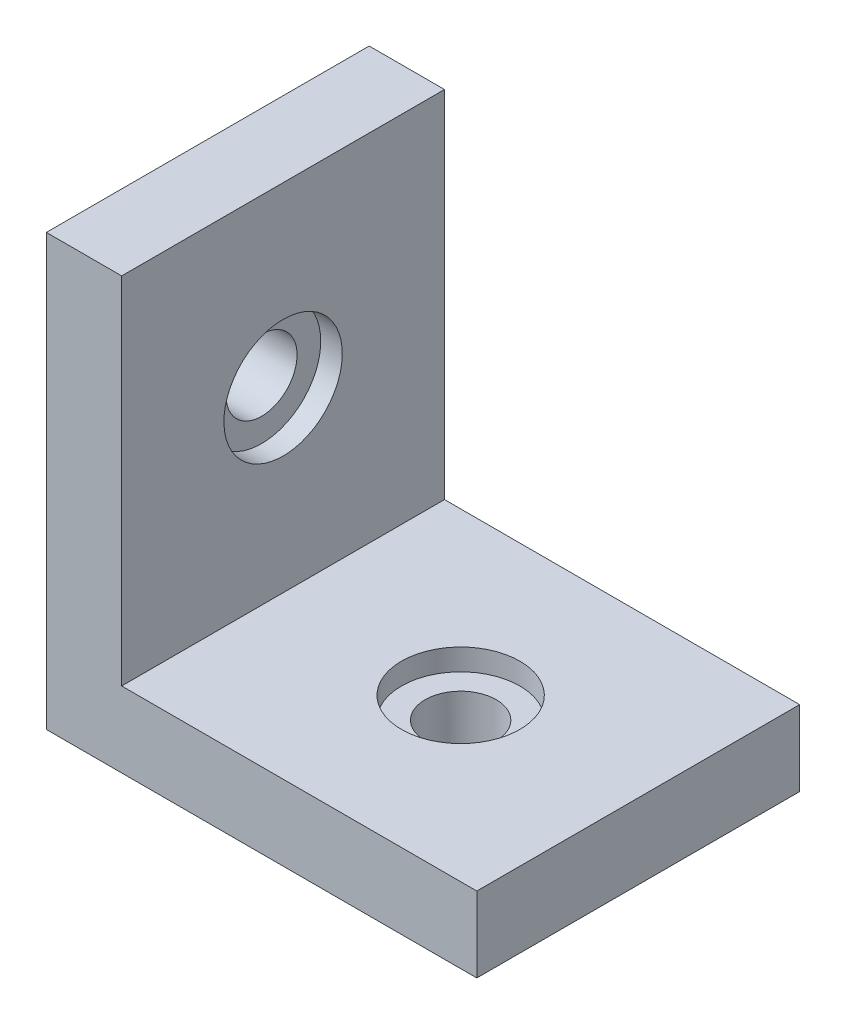
ISO-10303-21;
HEADER;
FILE_DESCRIPTION(('STEP AP214'),'2;1');
FILE_NAME('part.step','',(''),(''),'','','');
FILE_SCHEMA(('AUTOMOTIVE_DESIGN { 1 0 10303 214 1 1 1 1 }'));
ENDSEC;
DATA;
#1=APPLICATION_CONTEXT('core data for automotive mechanical design processes');
#2=APPLICATION_PROTOCOL_DEFINITION('international standard','automotive_design',2000,#1);
#3=PRODUCT_CONTEXT('',#1,'mechanical');
#4=PRODUCT('Part','Part','',(#3));
#5=PRODUCT_RELATED_PRODUCT_CATEGORY('part','',(#4));
#6=PRODUCT_DEFINITION_FORMATION('','',#4);
#7=PRODUCT_DEFINITION_CONTEXT('part definition',#1,'design');
#8=PRODUCT_DEFINITION('design','',#6,#7);
#9=PRODUCT_DEFINITION_SHAPE('','',#8);
#10=(LENGTH_UNIT() NAMED_UNIT(*) SI_UNIT(.MILLI.,.METRE.));
#11=(NAMED_UNIT(*) PLANE_ANGLE_UNIT() SI_UNIT($,.RADIAN.));
#12=(NAMED_UNIT(*) SI_UNIT($,.STERADIAN.) SOLID_ANGLE_UNIT());
#13=UNCERTAINTY_MEASURE_WITH_UNIT(LENGTH_MEASURE(1.E-05),#10,'distance_accuracy_value','');
#14=(GEOMETRIC_REPRESENTATION_CONTEXT(3) GLOBAL_UNCERTAINTY_ASSIGNED_CONTEXT((#13)) GLOBAL_UNIT_ASSIGNED_CONTEXT((#10,
#11,#12)) REPRESENTATION_CONTEXT('',''));
#15=CARTESIAN_POINT('',(0.,0.,0.));
#16=DIRECTION('',(0.,0.,1.));
#17=DIRECTION('',(1.,0.,0.));
#18=AXIS2_PLACEMENT_3D('',#15,#16,#17);
#19=CARTESIAN_POINT('',(-10.5320903285774,11.2977885735323,15.));
#20=DIRECTION('',(0.,1.,0.));
#21=DIRECTION('',(0.,0.,1.));
#22=AXIS2_PLACEMENT_3D('',#19,#20,#21);
#23=PLANE('',#22);
#24=DIRECTION('',(1.,0.,0.));
#25=VECTOR('',#24,1.);
#26=CARTESIAN_POINT('',(-10.5320903285774,11.2977885735323,0.));
#27=LINE('',#26,#25);
#28=CARTESIAN_POINT('',(-12.1110377274454,11.2977885735323,0.));
#29=VERTEX_POINT('',#28);
#30=CARTESIAN_POINT('',(-8.61103772744536,11.2977885735323,0.));
#31=VERTEX_POINT('',#30);
#32=EDGE_CURVE('E129',#29,#31,#27,.T.);
#33=ORIENTED_EDGE('',*,*,#32,.F.);
#34=DIRECTION('',(0.,0.,-1.));
#35=VECTOR('',#34,1.);
#36=CARTESIAN_POINT('',(-12.1110377274454,11.2977885735323,15.));
#37=LINE('',#36,#35);
#38=CARTESIAN_POINT('',(-12.1110377274454,11.2977885735323,15.));
#39=VERTEX_POINT('',#38);
#40=EDGE_CURVE('E10',#39,#29,#37,.T.);
#41=ORIENTED_EDGE('',*,*,#40,.F.);
#42=DIRECTION('',(1.,0.,0.));
#43=VECTOR('',#42,1.);
#44=CARTESIAN_POINT('',(-10.5320903285774,11.2977885735323,15.));
#45=LINE('',#44,#43);
#46=CARTESIAN_POINT('',(-8.61103772744536,11.2977885735323,15.));
#47=VERTEX_POINT('',#46);
#48=EDGE_CURVE('E102',#39,#47,#45,.T.);
#49=ORIENTED_EDGE('',*,*,#48,.T.);
#50=DIRECTION('',(0.,0.,-1.));
#51=VECTOR('',#50,1.);
#52=CARTESIAN_POINT('',(-8.61103772744536,11.2977885735323,15.));
#53=LINE('',#52,#51);
#54=EDGE_CURVE('E128',#47,#31,#53,.T.);
#55=ORIENTED_EDGE('',*,*,#54,.T.);
#56=EDGE_LOOP('',(#33,#41,#49,#55));
#57=FACE_BOUND('',#56,.T.);
#58=ADVANCED_FACE('F16',(#57),#23,.T.);
#59=CARTESIAN_POINT('',(-12.1110377274454,0.0697183422744274,15.));
#60=DIRECTION('',(1.,0.,0.));
#61=DIRECTION('',(0.,0.,-1.));
#62=AXIS2_PLACEMENT_3D('',#59,#60,#61);
#63=PLANE('',#62);
#64=CARTESIAN_POINT('',(-12.1110377274363,3.04778857353234,7.5));
#65=DIRECTION('',(1.,0.,0.));
#66=DIRECTION('',(0.,0.,-1.));
#67=AXIS2_PLACEMENT_3D('',#64,#65,#66);
#68=CIRCLE('',#67,1.65);
#69=CARTESIAN_POINT('',(-12.1110377274363,3.04778857353234,5.85));
#70=VERTEX_POINT('',#69);
#71=EDGE_CURVE('E133',#70,#70,#68,.F.);
#72=ORIENTED_EDGE('',*,*,#71,.F.);
#73=EDGE_LOOP('',(#72));
#74=FACE_BOUND('',#73,.T.);
#75=DIRECTION('',(0.,-1.,0.));
#76=VECTOR('',#75,1.);
#77=CARTESIAN_POINT('',(-12.1110377274454,0.0697183422744274,0.));
#78=LINE('',#77,#76);
#79=CARTESIAN_POINT('',(-12.1110377274454,-8.70221142646765,0.));
#80=VERTEX_POINT('',#79);
#81=EDGE_CURVE('E109',#29,#80,#78,.T.);
#82=ORIENTED_EDGE('',*,*,#81,.T.);
#83=DIRECTION('',(0.,0.,-1.));
#84=VECTOR('',#83,1.);
#85=CARTESIAN_POINT('',(-12.1110377274454,-8.70221142646765,15.));
#86=LINE('',#85,#84);
#87=CARTESIAN_POINT('',(-12.1110377274454,-8.70221142646765,15.));
#88=VERTEX_POINT('',#87);
#89=EDGE_CURVE('E25',#88,#80,#86,.T.);
#90=ORIENTED_EDGE('',*,*,#89,.F.);
#91=DIRECTION('',(0.,-1.,0.));
#92=VECTOR('',#91,1.);
#93=CARTESIAN_POINT('',(-12.1110377274454,0.0697183422744274,15.));
#94=LINE('',#93,#92);
#95=EDGE_CURVE('E96',#39,#88,#94,.T.);
#96=ORIENTED_EDGE('',*,*,#95,.F.);
#97=ORIENTED_EDGE('',*,*,#40,.T.);
#98=EDGE_LOOP('',(#82,#90,#96,#97));
#99=FACE_BOUND('',#98,.T.);
#100=ADVANCED_FACE('F107',(#74,#99),#63,.F.);
#101=CARTESIAN_POINT('',(-2.11103772744537,-8.70221142646765,15.));
#102=DIRECTION('',(0.,1.,0.));
#103=DIRECTION('',(0.,0.,1.));
#104=AXIS2_PLACEMENT_3D('',#101,#102,#103);
#105=PLANE('',#104);
#106=CARTESIAN_POINT('',(-0.361037727445362,-8.70221142645278,7.5));
#107=DIRECTION('',(0.,1.,0.));
#108=DIRECTION('',(0.,0.,1.));
#109=AXIS2_PLACEMENT_3D('',#106,#107,#108);
#110=CIRCLE('',#109,1.65);
#111=CARTESIAN_POINT('',(-0.361037727445362,-8.70221142645278,9.15));
#112=VERTEX_POINT('',#111);
#113=EDGE_CURVE('E175',#112,#112,#110,.F.);
#114=ORIENTED_EDGE('',*,*,#113,.F.);
#115=EDGE_LOOP('',(#114));
#116=FACE_BOUND('',#115,.T.);
#117=DIRECTION('',(1.,0.,0.));
#118=VECTOR('',#117,1.);
#119=CARTESIAN_POINT('',(-2.11103772744537,-8.70221142646765,0.));
#120=LINE('',#119,#118);
#121=CARTESIAN_POINT('',(7.88896227255464,-8.70221142646765,0.));
#122=VERTEX_POINT('',#121);
#123=EDGE_CURVE('E67',#80,#122,#120,.T.);
#124=ORIENTED_EDGE('',*,*,#123,.T.);
#125=DIRECTION('',(0.,0.,-1.));
#126=VECTOR('',#125,1.);
#127=CARTESIAN_POINT('',(7.88896227255464,-8.70221142646765,15.));
#128=LINE('',#127,#126);
#129=CARTESIAN_POINT('',(7.88896227255464,-8.70221142646765,15.));
#130=VERTEX_POINT('',#129);
#131=EDGE_CURVE('E111',#130,#122,#128,.T.);
#132=ORIENTED_EDGE('',*,*,#131,.F.);
#133=DIRECTION('',(1.,0.,0.));
#134=VECTOR('',#133,1.);
#135=CARTESIAN_POINT('',(-2.11103772744537,-8.70221142646765,15.));
#136=LINE('',#135,#134);
#137=EDGE_CURVE('E100',#88,#130,#136,.T.);
#138=ORIENTED_EDGE('',*,*,#137,.F.);
#139=ORIENTED_EDGE('',*,*,#89,.T.);
#140=EDGE_LOOP('',(#124,#132,#138,#139));
#141=FACE_BOUND('',#140,.T.);
#142=ADVANCED_FACE('F113',(#116,#141),#105,.F.);
#143=CARTESIAN_POINT('',(7.88896227255464,-7.47414119520973,15.));
#144=DIRECTION('',(-1.,0.,0.));
#145=DIRECTION('',(0.,0.,1.));
#146=AXIS2_PLACEMENT_3D('',#143,#144,#145);
#147=PLANE('',#146);
#148=DIRECTION('',(0.,1.,0.));
#149=VECTOR('',#148,1.);
#150=CARTESIAN_POINT('',(7.88896227255464,-7.47414119520973,0.));
#151=LINE('',#150,#149);
#152=CARTESIAN_POINT('',(7.88896227255464,-5.20221142646766,0.));
#153=VERTEX_POINT('',#152);
#154=EDGE_CURVE('E140',#122,#153,#151,.T.);
#155=ORIENTED_EDGE('',*,*,#154,.T.);
#156=DIRECTION('',(0.,0.,-1.));
#157=VECTOR('',#156,1.);
#158=CARTESIAN_POINT('',(7.88896227255464,-5.20221142646766,15.));
#159=LINE('',#158,#157);
#160=CARTESIAN_POINT('',(7.88896227255464,-5.20221142646766,15.));
#161=VERTEX_POINT('',#160);
#162=EDGE_CURVE('E75',#161,#153,#159,.T.);
#163=ORIENTED_EDGE('',*,*,#162,.F.);
#164=DIRECTION('',(0.,1.,0.));
#165=VECTOR('',#164,1.);
#166=CARTESIAN_POINT('',(7.88896227255464,-7.47414119520973,15.));
#167=LINE('',#166,#165);
#168=EDGE_CURVE('E38',#130,#161,#167,.T.);
#169=ORIENTED_EDGE('',*,*,#168,.F.);
#170=ORIENTED_EDGE('',*,*,#131,.T.);
#171=EDGE_LOOP('',(#155,#163,#169,#170));
#172=FACE_BOUND('',#171,.T.);
#173=ADVANCED_FACE('F216',(#172),#147,.F.);
#174=CARTESIAN_POINT('',(-2.11103772744537,-5.20221142646766,15.));
#175=DIRECTION('',(0.,1.,0.));
#176=DIRECTION('',(0.,0.,1.));
#177=AXIS2_PLACEMENT_3D('',#174,#175,#176);
#178=PLANE('',#177);
#179=CARTESIAN_POINT('',(-0.361037727445362,-5.20221142646766,7.5));
#180=DIRECTION('',(0.,1.,0.));
#181=DIRECTION('',(-1.,0.,0.));
#182=AXIS2_PLACEMENT_3D('',#179,#180,#181);
#183=CIRCLE('',#182,2.75);
#184=CARTESIAN_POINT('',(-3.11103772744536,-5.20221142646766,7.5));
#185=VERTEX_POINT('',#184);
#186=EDGE_CURVE('E186',#185,#185,#183,.T.);
#187=ORIENTED_EDGE('',*,*,#186,.F.);
#188=EDGE_LOOP('',(#187));
#189=FACE_BOUND('',#188,.T.);
#190=DIRECTION('',(1.,0.,0.));
#191=VECTOR('',#190,1.);
#192=CARTESIAN_POINT('',(-2.11103772744537,-5.20221142646766,0.));
#193=LINE('',#192,#191);
#194=CARTESIAN_POINT('',(-8.61103772744536,-5.20221142646766,0.));
#195=VERTEX_POINT('',#194);
#196=EDGE_CURVE('E137',#195,#153,#193,.T.);
#197=ORIENTED_EDGE('',*,*,#196,.F.);
#198=DIRECTION('',(0.,0.,-1.));
#199=VECTOR('',#198,1.);
#200=CARTESIAN_POINT('',(-8.61103772744536,-5.20221142646766,15.));
#201=LINE('',#200,#199);
#202=CARTESIAN_POINT('',(-8.61103772744536,-5.20221142646766,15.));
#203=VERTEX_POINT('',#202);
#204=EDGE_CURVE('E149',#203,#195,#201,.T.);
#205=ORIENTED_EDGE('',*,*,#204,.F.);
#206=DIRECTION('',(1.,0.,0.));
#207=VECTOR('',#206,1.);
#208=CARTESIAN_POINT('',(-2.11103772744537,-5.20221142646766,15.));
#209=LINE('',#208,#207);
#210=EDGE_CURVE('E115',#203,#161,#209,.T.);
#211=ORIENTED_EDGE('',*,*,#210,.T.);
#212=ORIENTED_EDGE('',*,*,#162,.T.);
#213=EDGE_LOOP('',(#197,#205,#211,#212));
#214=FACE_BOUND('',#213,.T.);
#215=ADVANCED_FACE('F158',(#189,#214),#178,.T.);
#216=CARTESIAN_POINT('',(-8.61103772744536,0.0697183422744274,15.));
#217=DIRECTION('',(1.,0.,0.));
#218=DIRECTION('',(0.,1.,0.));
#219=AXIS2_PLACEMENT_3D('',#216,#217,#218);
#220=PLANE('',#219);
#221=CARTESIAN_POINT('',(-8.61103772744536,3.04778857353234,7.5));
#222=DIRECTION('',(1.,0.,0.));
#223=DIRECTION('',(0.,1.,0.));
#224=AXIS2_PLACEMENT_3D('',#221,#222,#223);
#225=CIRCLE('',#224,2.75);
#226=CARTESIAN_POINT('',(-8.61103772744536,5.79778857353234,7.5));
#227=VERTEX_POINT('',#226);
#228=EDGE_CURVE('E170',#227,#227,#225,.T.);
#229=ORIENTED_EDGE('',*,*,#228,.F.);
#230=EDGE_LOOP('',(#229));
#231=FACE_BOUND('',#230,.T.);
#232=DIRECTION('',(0.,-1.,0.));
#233=VECTOR('',#232,1.);
#234=CARTESIAN_POINT('',(-8.61103772744536,0.0697183422744274,0.));
#235=LINE('',#234,#233);
#236=EDGE_CURVE('E136',#31,#195,#235,.T.);
#237=ORIENTED_EDGE('',*,*,#236,.F.);
#238=ORIENTED_EDGE('',*,*,#54,.F.);
#239=DIRECTION('',(0.,-1.,0.));
#240=VECTOR('',#239,1.);
#241=CARTESIAN_POINT('',(-8.61103772744536,0.0697183422744274,15.));
#242=LINE('',#241,#240);
#243=EDGE_CURVE('E105',#47,#203,#242,.T.);
#244=ORIENTED_EDGE('',*,*,#243,.T.);
#245=ORIENTED_EDGE('',*,*,#204,.T.);
#246=EDGE_LOOP('',(#237,#238,#244,#245));
#247=FACE_BOUND('',#246,.T.);
#248=ADVANCED_FACE('F157',(#231,#247),#220,.T.);
#249=CARTESIAN_POINT('',(-2.11103772744536,1.29778857353235,15.));
#250=DIRECTION('',(0.,0.,1.));
#251=DIRECTION('',(1.,0.,0.));
#252=AXIS2_PLACEMENT_3D('',#249,#250,#251);
#253=PLANE('',#252);
#254=ORIENTED_EDGE('',*,*,#48,.F.);
#255=ORIENTED_EDGE('',*,*,#95,.T.);
#256=ORIENTED_EDGE('',*,*,#137,.T.);
#257=ORIENTED_EDGE('',*,*,#168,.T.);
#258=ORIENTED_EDGE('',*,*,#210,.F.);
#259=ORIENTED_EDGE('',*,*,#243,.F.);
#260=EDGE_LOOP('',(#254,#255,#256,#257,#258,#259));
#261=FACE_BOUND('',#260,.T.);
#262=ADVANCED_FACE('F98',(#261),#253,.T.);
#263=CARTESIAN_POINT('',(-2.11103772744536,1.29778857353235,0.));
#264=DIRECTION('',(0.,0.,1.));
#265=DIRECTION('',(1.,0.,0.));
#266=AXIS2_PLACEMENT_3D('',#263,#264,#265);
#267=PLANE('',#266);
#268=ORIENTED_EDGE('',*,*,#32,.T.);
#269=ORIENTED_EDGE('',*,*,#236,.T.);
#270=ORIENTED_EDGE('',*,*,#196,.T.);
#271=ORIENTED_EDGE('',*,*,#154,.F.);
#272=ORIENTED_EDGE('',*,*,#123,.F.);
#273=ORIENTED_EDGE('',*,*,#81,.F.);
#274=EDGE_LOOP('',(#268,#269,#270,#271,#272,#273));
#275=FACE_BOUND('',#274,.T.);
#276=ADVANCED_FACE('F161',(#275),#267,.F.);
#277=CARTESIAN_POINT('',(-500000.,3.04778857350173,7.5));
#278=DIRECTION('',(1.,0.,0.));
#279=DIRECTION('',(0.,1.,0.));
#280=AXIS2_PLACEMENT_3D('',#277,#278,#279);
#281=CYLINDRICAL_SURFACE('',#280,1.65);
#282=CARTESIAN_POINT('',(-9.61103772744536,3.04778857353234,7.5));
#283=DIRECTION('',(1.,0.,0.));
#284=DIRECTION('',(0.,1.,0.));
#285=AXIS2_PLACEMENT_3D('',#282,#283,#284);
#286=CIRCLE('',#285,1.65);
#287=CARTESIAN_POINT('',(-9.61103772744536,4.69778857353234,7.5));
#288=VERTEX_POINT('',#287);
#289=EDGE_CURVE('E174',#288,#288,#286,.T.);
#290=ORIENTED_EDGE('',*,*,#289,.T.);
#291=EDGE_LOOP('',(#290));
#292=FACE_BOUND('',#291,.T.);
#293=ORIENTED_EDGE('',*,*,#71,.T.);
#294=EDGE_LOOP('',(#293));
#295=FACE_BOUND('',#294,.T.);
#296=ADVANCED_FACE('F239',(#292,#295),#281,.F.);
#297=CARTESIAN_POINT('',(-9.61103772744536,3.04778857353234,7.5));
#298=DIRECTION('',(1.,0.,0.));
#299=DIRECTION('',(0.,1.,0.));
#300=AXIS2_PLACEMENT_3D('',#297,#298,#299);
#301=CYLINDRICAL_SURFACE('',#300,2.75);
#302=CARTESIAN_POINT('',(-9.61103772744536,3.04778857353234,7.5));
#303=DIRECTION('',(1.,0.,0.));
#304=DIRECTION('',(0.,1.,0.));
#305=AXIS2_PLACEMENT_3D('',#302,#303,#304);
#306=CIRCLE('',#305,2.75);
#307=CARTESIAN_POINT('',(-9.61103772744536,5.79778857353234,7.5));
#308=VERTEX_POINT('',#307);
#309=EDGE_CURVE('E169',#308,#308,#306,.T.);
#310=ORIENTED_EDGE('',*,*,#309,.F.);
#311=EDGE_LOOP('',(#310));
#312=FACE_BOUND('',#311,.T.);
#313=ORIENTED_EDGE('',*,*,#228,.T.);
#314=EDGE_LOOP('',(#313));
#315=FACE_BOUND('',#314,.T.);
#316=ADVANCED_FACE('F241',(#312,#315),#301,.F.);
#317=CARTESIAN_POINT('',(-9.61103772744536,3.04778857353234,7.5));
#318=DIRECTION('',(1.,0.,0.));
#319=DIRECTION('',(0.,1.,0.));
#320=AXIS2_PLACEMENT_3D('',#317,#318,#319);
#321=PLANE('',#320);
#322=ORIENTED_EDGE('',*,*,#289,.F.);
#323=EDGE_LOOP('',(#322));
#324=FACE_BOUND('',#323,.T.);
#325=ORIENTED_EDGE('',*,*,#309,.T.);
#326=EDGE_LOOP('',(#325));
#327=FACE_BOUND('',#326,.T.);
#328=ADVANCED_FACE('F248',(#324,#327),#321,.T.);
#329=CARTESIAN_POINT('',(-0.361037727445362,-500000.,7.5));
#330=DIRECTION('',(0.,1.,0.));
#331=DIRECTION('',(0.,0.,1.));
#332=AXIS2_PLACEMENT_3D('',#329,#330,#331);
#333=CYLINDRICAL_SURFACE('',#332,1.65);
#334=CARTESIAN_POINT('',(-0.361037727445362,-6.20221142646766,7.5));
#335=DIRECTION('',(0.,1.,0.));
#336=DIRECTION('',(-1.,0.,0.));
#337=AXIS2_PLACEMENT_3D('',#334,#335,#336);
#338=CIRCLE('',#337,1.65);
#339=CARTESIAN_POINT('',(-2.01103772744536,-6.20221142646766,7.5));
#340=VERTEX_POINT('',#339);
#341=EDGE_CURVE('E190',#340,#340,#338,.T.);
#342=ORIENTED_EDGE('',*,*,#341,.T.);
#343=EDGE_LOOP('',(#342));
#344=FACE_BOUND('',#343,.T.);
#345=ORIENTED_EDGE('',*,*,#113,.T.);
#346=EDGE_LOOP('',(#345));
#347=FACE_BOUND('',#346,.T.);
#348=ADVANCED_FACE('F200',(#344,#347),#333,.F.);
#349=CARTESIAN_POINT('',(-0.361037727445362,-6.20221142646766,7.5));
#350=DIRECTION('',(0.,1.,0.));
#351=DIRECTION('',(0.,0.,1.));
#352=AXIS2_PLACEMENT_3D('',#349,#350,#351);
#353=CYLINDRICAL_SURFACE('',#352,2.75);
#354=CARTESIAN_POINT('',(-0.361037727445362,-6.20221142646766,7.5));
#355=DIRECTION('',(0.,1.,0.));
#356=DIRECTION('',(-1.,0.,0.));
#357=AXIS2_PLACEMENT_3D('',#354,#355,#356);
#358=CIRCLE('',#357,2.75);
#359=CARTESIAN_POINT('',(-3.11103772744536,-6.20221142646766,7.5));
#360=VERTEX_POINT('',#359);
#361=EDGE_CURVE('E185',#360,#360,#358,.T.);
#362=ORIENTED_EDGE('',*,*,#361,.F.);
#363=EDGE_LOOP('',(#362));
#364=FACE_BOUND('',#363,.T.);
#365=ORIENTED_EDGE('',*,*,#186,.T.);
#366=EDGE_LOOP('',(#365));
#367=FACE_BOUND('',#366,.T.);
#368=ADVANCED_FACE('F206',(#364,#367),#353,.F.);
#369=CARTESIAN_POINT('',(-0.361037727445362,-6.20221142646766,7.5));
#370=DIRECTION('',(0.,1.,0.));
#371=DIRECTION('',(-1.,0.,0.));
#372=AXIS2_PLACEMENT_3D('',#369,#370,#371);
#373=PLANE('',#372);
#374=ORIENTED_EDGE('',*,*,#341,.F.);
#375=EDGE_LOOP('',(#374));
#376=FACE_BOUND('',#375,.T.);
#377=ORIENTED_EDGE('',*,*,#361,.T.);
#378=EDGE_LOOP('',(#377));
#379=FACE_BOUND('',#378,.T.);
#380=ADVANCED_FACE('F203',(#376,#379),#373,.T.);
#381=CLOSED_SHELL('',(#58,#100,#142,#173,#215,#248,#262,#276,#296,#316,#328,#348,#368,#380));
#382=MANIFOLD_SOLID_BREP('B1',#381);
#383=ADVANCED_BREP_SHAPE_REPRESENTATION('',(#18,#382),#14);
#384=SHAPE_DEFINITION_REPRESENTATION(#9,#383);
ENDSEC;
END-ISO-10303-21;
